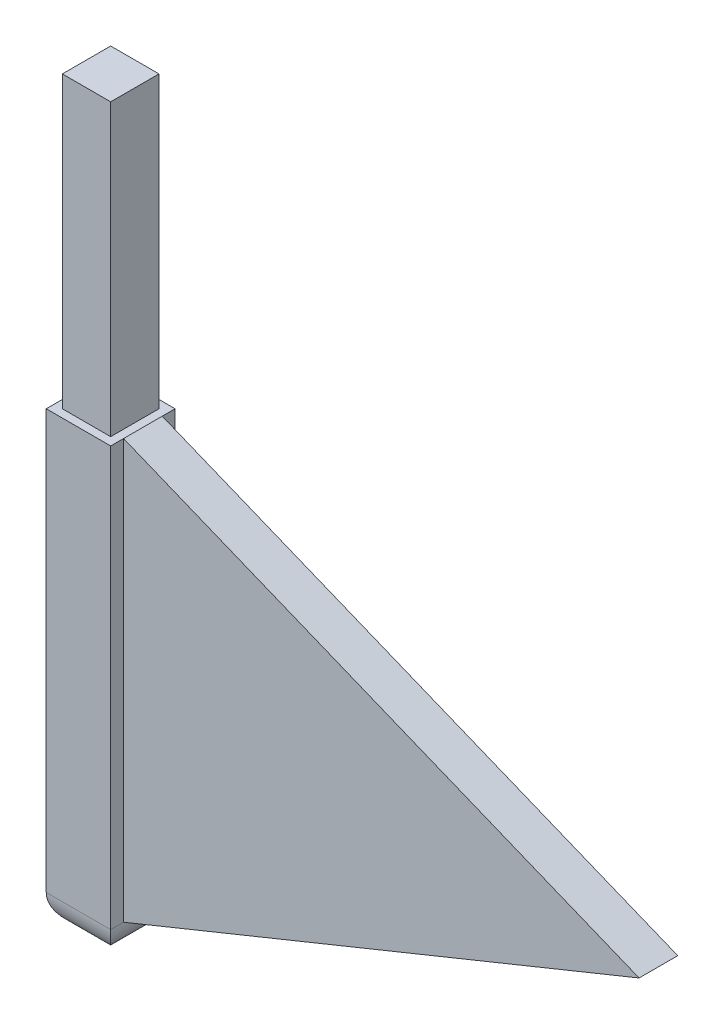
ISO-10303-21;
HEADER;
FILE_DESCRIPTION(('STEP AP214'),'2;1');
FILE_NAME('part.step','',(''),(''),'','','');
FILE_SCHEMA(('AUTOMOTIVE_DESIGN { 1 0 10303 214 1 1 1 1 }'));
ENDSEC;
DATA;
#1=APPLICATION_CONTEXT('core data for automotive mechanical design processes');
#2=APPLICATION_PROTOCOL_DEFINITION('international standard','automotive_design',2000,#1);
#3=PRODUCT_CONTEXT('',#1,'mechanical');
#4=PRODUCT('Part','Part','',(#3));
#5=PRODUCT_RELATED_PRODUCT_CATEGORY('part','',(#4));
#6=PRODUCT_DEFINITION_FORMATION('','',#4);
#7=PRODUCT_DEFINITION_CONTEXT('part definition',#1,'design');
#8=PRODUCT_DEFINITION('design','',#6,#7);
#9=PRODUCT_DEFINITION_SHAPE('','',#8);
#10=(LENGTH_UNIT() NAMED_UNIT(*) SI_UNIT(.MILLI.,.METRE.));
#11=(NAMED_UNIT(*) PLANE_ANGLE_UNIT() SI_UNIT($,.RADIAN.));
#12=(NAMED_UNIT(*) SI_UNIT($,.STERADIAN.) SOLID_ANGLE_UNIT());
#13=UNCERTAINTY_MEASURE_WITH_UNIT(LENGTH_MEASURE(1.E-05),#10,'distance_accuracy_value','');
#14=(GEOMETRIC_REPRESENTATION_CONTEXT(3) GLOBAL_UNCERTAINTY_ASSIGNED_CONTEXT((#13)) GLOBAL_UNIT_ASSIGNED_CONTEXT((#10,
#11,#12)) REPRESENTATION_CONTEXT('',''));
#15=CARTESIAN_POINT('',(0.,0.,0.));
#16=DIRECTION('',(0.,0.,1.));
#17=DIRECTION('',(1.,0.,0.));
#18=AXIS2_PLACEMENT_3D('',#15,#16,#17);
#19=CARTESIAN_POINT('',(2.54,29.21,0.));
#20=DIRECTION('',(-1.,0.,0.));
#21=DIRECTION('',(0.,0.,1.));
#22=AXIS2_PLACEMENT_3D('',#19,#20,#21);
#23=PLANE('',#22);
#24=DIRECTION('',(0.,-1.,0.));
#25=VECTOR('',#24,1.);
#26=CARTESIAN_POINT('',(2.54,17.78,-0.508));
#27=LINE('',#26,#25);
#28=CARTESIAN_POINT('',(2.54,17.78,-0.508000000000002));
#29=VERTEX_POINT('',#28);
#30=CARTESIAN_POINT('',(2.54,1.27000000000001,-0.508000000000002));
#31=VERTEX_POINT('',#30);
#32=EDGE_CURVE('E141',#29,#31,#27,.T.);
#33=ORIENTED_EDGE('',*,*,#32,.F.);
#34=DIRECTION('',(0.,0.,-1.));
#35=VECTOR('',#34,1.);
#36=CARTESIAN_POINT('',(2.54,17.78,0.));
#37=LINE('',#36,#35);
#38=CARTESIAN_POINT('',(2.54,17.78,0.));
#39=VERTEX_POINT('',#38);
#40=EDGE_CURVE('E198',#39,#29,#37,.T.);
#41=ORIENTED_EDGE('',*,*,#40,.F.);
#42=DIRECTION('',(0.,-1.,0.));
#43=VECTOR('',#42,1.);
#44=CARTESIAN_POINT('',(2.54,29.21,0.));
#45=LINE('',#44,#43);
#46=CARTESIAN_POINT('',(2.54,1.27000000000001,0.));
#47=VERTEX_POINT('',#46);
#48=EDGE_CURVE('E207',#39,#47,#45,.T.);
#49=ORIENTED_EDGE('',*,*,#48,.T.);
#50=DIRECTION('',(0.,0.,-1.));
#51=VECTOR('',#50,1.);
#52=CARTESIAN_POINT('',(2.54,1.27,-2.54));
#53=LINE('',#52,#51);
#54=EDGE_CURVE('E222',#47,#31,#53,.T.);
#55=ORIENTED_EDGE('',*,*,#54,.T.);
#56=EDGE_LOOP('',(#33,#41,#49,#55));
#57=FACE_BOUND('',#56,.T.);
#58=ADVANCED_FACE('F48',(#57),#23,.F.);
#59=DIRECTION('',(0.,1.,0.));
#60=VECTOR('',#59,1.);
#61=CARTESIAN_POINT('',(2.54,17.78,-2.032));
#62=LINE('',#61,#60);
#63=CARTESIAN_POINT('',(2.54,1.27000000000001,-2.032));
#64=VERTEX_POINT('',#63);
#65=CARTESIAN_POINT('',(2.54,17.78,-2.032));
#66=VERTEX_POINT('',#65);
#67=EDGE_CURVE('E160',#64,#66,#62,.T.);
#68=ORIENTED_EDGE('',*,*,#67,.F.);
#69=CARTESIAN_POINT('',(2.54,1.27000000000001,-2.54));
#70=VERTEX_POINT('',#69);
#71=EDGE_CURVE('E219',#64,#70,#53,.T.);
#72=ORIENTED_EDGE('',*,*,#71,.T.);
#73=DIRECTION('',(0.,-1.,0.));
#74=VECTOR('',#73,1.);
#75=CARTESIAN_POINT('',(2.54,29.21,-2.54));
#76=LINE('',#75,#74);
#77=CARTESIAN_POINT('',(2.54,17.78,-2.54));
#78=VERTEX_POINT('',#77);
#79=EDGE_CURVE('E206',#78,#70,#76,.T.);
#80=ORIENTED_EDGE('',*,*,#79,.F.);
#81=EDGE_CURVE('E189',#66,#78,#37,.T.);
#82=ORIENTED_EDGE('',*,*,#81,.F.);
#83=EDGE_LOOP('',(#68,#72,#80,#82));
#84=FACE_BOUND('',#83,.T.);
#85=ADVANCED_FACE('F257',(#84),#23,.F.);
#86=CARTESIAN_POINT('',(0.,29.21,0.));
#87=DIRECTION('',(1.,0.,0.));
#88=DIRECTION('',(0.,0.,-1.));
#89=AXIS2_PLACEMENT_3D('',#86,#87,#88);
#90=PLANE('',#89);
#91=DIRECTION('',(0.,-1.,0.));
#92=VECTOR('',#91,1.);
#93=CARTESIAN_POINT('',(0.,29.21,-2.54));
#94=LINE('',#93,#92);
#95=CARTESIAN_POINT('',(0.,17.78,-2.54));
#96=VERTEX_POINT('',#95);
#97=CARTESIAN_POINT('',(0.,1.27000000000001,-2.54));
#98=VERTEX_POINT('',#97);
#99=EDGE_CURVE('E201',#96,#98,#94,.T.);
#100=ORIENTED_EDGE('',*,*,#99,.T.);
#101=DIRECTION('',(0.,0.,1.));
#102=VECTOR('',#101,1.);
#103=CARTESIAN_POINT('',(0.,1.27,0.));
#104=LINE('',#103,#102);
#105=CARTESIAN_POINT('',(0.,1.27000000000001,0.));
#106=VERTEX_POINT('',#105);
#107=EDGE_CURVE('E214',#98,#106,#104,.T.);
#108=ORIENTED_EDGE('',*,*,#107,.T.);
#109=DIRECTION('',(0.,-1.,0.));
#110=VECTOR('',#109,1.);
#111=CARTESIAN_POINT('',(0.,29.21,0.));
#112=LINE('',#111,#110);
#113=CARTESIAN_POINT('',(0.,17.78,0.));
#114=VERTEX_POINT('',#113);
#115=EDGE_CURVE('E211',#114,#106,#112,.T.);
#116=ORIENTED_EDGE('',*,*,#115,.F.);
#117=DIRECTION('',(0.,0.,1.));
#118=VECTOR('',#117,1.);
#119=CARTESIAN_POINT('',(0.,17.78,0.));
#120=LINE('',#119,#118);
#121=EDGE_CURVE('E203',#96,#114,#120,.T.);
#122=ORIENTED_EDGE('',*,*,#121,.F.);
#123=EDGE_LOOP('',(#100,#108,#116,#122));
#124=FACE_BOUND('',#123,.T.);
#125=ADVANCED_FACE('F248',(#124),#90,.F.);
#126=CARTESIAN_POINT('',(0.,29.21,0.));
#127=DIRECTION('',(0.,0.,-1.));
#128=DIRECTION('',(-1.,0.,0.));
#129=AXIS2_PLACEMENT_3D('',#126,#127,#128);
#130=PLANE('',#129);
#131=ORIENTED_EDGE('',*,*,#115,.T.);
#132=DIRECTION('',(1.,0.,0.));
#133=VECTOR('',#132,1.);
#134=CARTESIAN_POINT('',(2.54,1.27,0.));
#135=LINE('',#134,#133);
#136=EDGE_CURVE('E60',#106,#47,#135,.T.);
#137=ORIENTED_EDGE('',*,*,#136,.T.);
#138=ORIENTED_EDGE('',*,*,#48,.F.);
#139=DIRECTION('',(1.,0.,0.));
#140=VECTOR('',#139,1.);
#141=CARTESIAN_POINT('',(0.,17.78,0.));
#142=LINE('',#141,#140);
#143=EDGE_CURVE('E200',#114,#39,#142,.T.);
#144=ORIENTED_EDGE('',*,*,#143,.F.);
#145=EDGE_LOOP('',(#131,#137,#138,#144));
#146=FACE_BOUND('',#145,.T.);
#147=ADVANCED_FACE('F251',(#146),#130,.F.);
#148=CARTESIAN_POINT('',(0.,29.21,-2.54));
#149=DIRECTION('',(0.,0.,1.));
#150=DIRECTION('',(1.,0.,0.));
#151=AXIS2_PLACEMENT_3D('',#148,#149,#150);
#152=PLANE('',#151);
#153=ORIENTED_EDGE('',*,*,#79,.T.);
#154=DIRECTION('',(-1.,0.,0.));
#155=VECTOR('',#154,1.);
#156=CARTESIAN_POINT('',(0.,1.27,-2.54));
#157=LINE('',#156,#155);
#158=EDGE_CURVE('E217',#70,#98,#157,.T.);
#159=ORIENTED_EDGE('',*,*,#158,.T.);
#160=ORIENTED_EDGE('',*,*,#99,.F.);
#161=DIRECTION('',(-1.,0.,0.));
#162=VECTOR('',#161,1.);
#163=CARTESIAN_POINT('',(0.,17.78,-2.54));
#164=LINE('',#163,#162);
#165=EDGE_CURVE('E213',#78,#96,#164,.T.);
#166=ORIENTED_EDGE('',*,*,#165,.F.);
#167=EDGE_LOOP('',(#153,#159,#160,#166));
#168=FACE_BOUND('',#167,.T.);
#169=ADVANCED_FACE('F267',(#168),#152,.F.);
#170=CARTESIAN_POINT('',(1.27,17.78,-1.27));
#171=DIRECTION('',(0.,1.,0.));
#172=DIRECTION('',(0.,0.,1.));
#173=AXIS2_PLACEMENT_3D('',#170,#171,#172);
#174=PLANE('',#173);
#175=DIRECTION('',(0.,0.,1.));
#176=VECTOR('',#175,1.);
#177=CARTESIAN_POINT('',(2.54,17.78,-2.54));
#178=LINE('',#177,#176);
#179=EDGE_CURVE('E150',#66,#29,#178,.T.);
#180=ORIENTED_EDGE('',*,*,#179,.F.);
#181=ORIENTED_EDGE('',*,*,#81,.T.);
#182=ORIENTED_EDGE('',*,*,#165,.T.);
#183=ORIENTED_EDGE('',*,*,#121,.T.);
#184=ORIENTED_EDGE('',*,*,#143,.T.);
#185=ORIENTED_EDGE('',*,*,#40,.T.);
#186=EDGE_LOOP('',(#180,#181,#182,#183,#184,#185));
#187=FACE_BOUND('',#186,.T.);
#188=DIRECTION('',(-1.,0.,0.));
#189=VECTOR('',#188,1.);
#190=CARTESIAN_POINT('',(0.3175,17.78,-2.2225));
#191=LINE('',#190,#189);
#192=CARTESIAN_POINT('',(2.2225,17.78,-2.2225));
#193=VERTEX_POINT('',#192);
#194=CARTESIAN_POINT('',(0.3175,17.78,-2.2225));
#195=VERTEX_POINT('',#194);
#196=EDGE_CURVE('E173',#193,#195,#191,.T.);
#197=ORIENTED_EDGE('',*,*,#196,.F.);
#198=DIRECTION('',(0.,0.,-1.));
#199=VECTOR('',#198,1.);
#200=CARTESIAN_POINT('',(2.2225,17.78,-0.317500000000005));
#201=LINE('',#200,#199);
#202=CARTESIAN_POINT('',(2.2225,17.78,-0.317500000000005));
#203=VERTEX_POINT('',#202);
#204=EDGE_CURVE('E169',#203,#193,#201,.T.);
#205=ORIENTED_EDGE('',*,*,#204,.F.);
#206=DIRECTION('',(1.,0.,0.));
#207=VECTOR('',#206,1.);
#208=CARTESIAN_POINT('',(0.3175,17.78,-0.317500000000005));
#209=LINE('',#208,#207);
#210=CARTESIAN_POINT('',(0.3175,17.78,-0.317500000000005));
#211=VERTEX_POINT('',#210);
#212=EDGE_CURVE('E163',#211,#203,#209,.T.);
#213=ORIENTED_EDGE('',*,*,#212,.F.);
#214=DIRECTION('',(0.,0.,1.));
#215=VECTOR('',#214,1.);
#216=CARTESIAN_POINT('',(0.3175,17.78,-0.317500000000005));
#217=LINE('',#216,#215);
#218=EDGE_CURVE('E161',#195,#211,#217,.T.);
#219=ORIENTED_EDGE('',*,*,#218,.F.);
#220=EDGE_LOOP('',(#197,#205,#213,#219));
#221=FACE_BOUND('',#220,.T.);
#222=ADVANCED_FACE('F258',(#187,#221),#174,.T.);
#223=CARTESIAN_POINT('',(0.3175,17.78,-0.317500000000005));
#224=DIRECTION('',(-1.,0.,0.));
#225=DIRECTION('',(0.,0.,1.));
#226=AXIS2_PLACEMENT_3D('',#223,#224,#225);
#227=PLANE('',#226);
#228=DIRECTION('',(0.,0.,1.));
#229=VECTOR('',#228,1.);
#230=CARTESIAN_POINT('',(0.3175,29.21,-0.317500000000005));
#231=LINE('',#230,#229);
#232=CARTESIAN_POINT('',(0.3175,29.21,-2.2225));
#233=VERTEX_POINT('',#232);
#234=CARTESIAN_POINT('',(0.3175,29.21,-0.317500000000005));
#235=VERTEX_POINT('',#234);
#236=EDGE_CURVE('E172',#233,#235,#231,.T.);
#237=ORIENTED_EDGE('',*,*,#236,.F.);
#238=DIRECTION('',(0.,1.,0.));
#239=VECTOR('',#238,1.);
#240=CARTESIAN_POINT('',(0.3175,17.78,-2.2225));
#241=LINE('',#240,#239);
#242=EDGE_CURVE('E190',#195,#233,#241,.T.);
#243=ORIENTED_EDGE('',*,*,#242,.F.);
#244=ORIENTED_EDGE('',*,*,#218,.T.);
#245=DIRECTION('',(0.,1.,0.));
#246=VECTOR('',#245,1.);
#247=CARTESIAN_POINT('',(0.3175,17.78,-0.317500000000005));
#248=LINE('',#247,#246);
#249=EDGE_CURVE('E174',#211,#235,#248,.T.);
#250=ORIENTED_EDGE('',*,*,#249,.T.);
#251=EDGE_LOOP('',(#237,#243,#244,#250));
#252=FACE_BOUND('',#251,.T.);
#253=ADVANCED_FACE('F296',(#252),#227,.T.);
#254=CARTESIAN_POINT('',(0.3175,17.78,-2.2225));
#255=DIRECTION('',(0.,0.,-1.));
#256=DIRECTION('',(-1.,0.,0.));
#257=AXIS2_PLACEMENT_3D('',#254,#255,#256);
#258=PLANE('',#257);
#259=DIRECTION('',(-1.,0.,0.));
#260=VECTOR('',#259,1.);
#261=CARTESIAN_POINT('',(0.3175,29.21,-2.2225));
#262=LINE('',#261,#260);
#263=CARTESIAN_POINT('',(2.2225,29.21,-2.2225));
#264=VERTEX_POINT('',#263);
#265=EDGE_CURVE('E164',#264,#233,#262,.T.);
#266=ORIENTED_EDGE('',*,*,#265,.F.);
#267=DIRECTION('',(0.,1.,0.));
#268=VECTOR('',#267,1.);
#269=CARTESIAN_POINT('',(2.2225,17.78,-2.2225));
#270=LINE('',#269,#268);
#271=EDGE_CURVE('E187',#193,#264,#270,.T.);
#272=ORIENTED_EDGE('',*,*,#271,.F.);
#273=ORIENTED_EDGE('',*,*,#196,.T.);
#274=ORIENTED_EDGE('',*,*,#242,.T.);
#275=EDGE_LOOP('',(#266,#272,#273,#274));
#276=FACE_BOUND('',#275,.T.);
#277=ADVANCED_FACE('F297',(#276),#258,.T.);
#278=CARTESIAN_POINT('',(2.2225,17.78,-0.317500000000005));
#279=DIRECTION('',(1.,0.,0.));
#280=DIRECTION('',(0.,0.,-1.));
#281=AXIS2_PLACEMENT_3D('',#278,#279,#280);
#282=PLANE('',#281);
#283=DIRECTION('',(0.,0.,-1.));
#284=VECTOR('',#283,1.);
#285=CARTESIAN_POINT('',(2.2225,29.21,-0.317500000000005));
#286=LINE('',#285,#284);
#287=CARTESIAN_POINT('',(2.2225,29.21,-0.317500000000005));
#288=VERTEX_POINT('',#287);
#289=EDGE_CURVE('E185',#288,#264,#286,.T.);
#290=ORIENTED_EDGE('',*,*,#289,.F.);
#291=DIRECTION('',(0.,1.,0.));
#292=VECTOR('',#291,1.);
#293=CARTESIAN_POINT('',(2.2225,17.78,-0.317500000000005));
#294=LINE('',#293,#292);
#295=EDGE_CURVE('E191',#203,#288,#294,.T.);
#296=ORIENTED_EDGE('',*,*,#295,.F.);
#297=ORIENTED_EDGE('',*,*,#204,.T.);
#298=ORIENTED_EDGE('',*,*,#271,.T.);
#299=EDGE_LOOP('',(#290,#296,#297,#298));
#300=FACE_BOUND('',#299,.T.);
#301=ADVANCED_FACE('F291',(#300),#282,.T.);
#302=CARTESIAN_POINT('',(0.3175,17.78,-0.317500000000005));
#303=DIRECTION('',(0.,0.,1.));
#304=DIRECTION('',(1.,0.,0.));
#305=AXIS2_PLACEMENT_3D('',#302,#303,#304);
#306=PLANE('',#305);
#307=DIRECTION('',(1.,0.,0.));
#308=VECTOR('',#307,1.);
#309=CARTESIAN_POINT('',(0.3175,29.21,-0.317500000000005));
#310=LINE('',#309,#308);
#311=EDGE_CURVE('E180',#235,#288,#310,.T.);
#312=ORIENTED_EDGE('',*,*,#311,.F.);
#313=ORIENTED_EDGE('',*,*,#249,.F.);
#314=ORIENTED_EDGE('',*,*,#212,.T.);
#315=ORIENTED_EDGE('',*,*,#295,.T.);
#316=EDGE_LOOP('',(#312,#313,#314,#315));
#317=FACE_BOUND('',#316,.T.);
#318=ADVANCED_FACE('F290',(#317),#306,.T.);
#319=CARTESIAN_POINT('',(0.,29.21,0.));
#320=DIRECTION('',(0.,-1.,0.));
#321=DIRECTION('',(0.,0.,-1.));
#322=AXIS2_PLACEMENT_3D('',#319,#320,#321);
#323=PLANE('',#322);
#324=ORIENTED_EDGE('',*,*,#236,.T.);
#325=ORIENTED_EDGE('',*,*,#311,.T.);
#326=ORIENTED_EDGE('',*,*,#289,.T.);
#327=ORIENTED_EDGE('',*,*,#265,.T.);
#328=EDGE_LOOP('',(#324,#325,#326,#327));
#329=FACE_BOUND('',#328,.T.);
#330=ADVANCED_FACE('F281',(#329),#323,.F.);
#331=CARTESIAN_POINT('',(1.27,1.27,0.));
#332=DIRECTION('',(0.,0.,1.));
#333=DIRECTION('',(1.,0.,0.));
#334=AXIS2_PLACEMENT_3D('',#331,#332,#333);
#335=CYLINDRICAL_SURFACE('',#334,1.27);
#336=CARTESIAN_POINT('',(1.27,1.27,-1.27));
#337=DIRECTION('',(0.707106781186547,0.,0.707106781186547));
#338=DIRECTION('',(-0.707106781186547,0.,0.707106781186547));
#339=AXIS2_PLACEMENT_3D('',#336,#337,#338);
#340=ELLIPSE('',#339,1.79605122421383,1.27);
#341=CARTESIAN_POINT('',(1.27,0.,-1.27));
#342=VERTEX_POINT('',#341);
#343=EDGE_CURVE('E178',#70,#342,#340,.F.);
#344=ORIENTED_EDGE('',*,*,#343,.F.);
#345=ORIENTED_EDGE('',*,*,#71,.F.);
#346=DIRECTION('',(0.,0.,-1.));
#347=VECTOR('',#346,1.);
#348=CARTESIAN_POINT('',(2.54,1.27000000000001,-0.508000000000002));
#349=LINE('',#348,#347);
#350=EDGE_CURVE('E154',#31,#64,#349,.T.);
#351=ORIENTED_EDGE('',*,*,#350,.F.);
#352=ORIENTED_EDGE('',*,*,#54,.F.);
#353=CARTESIAN_POINT('',(1.27,1.27,-1.27));
#354=DIRECTION('',(-0.707106781186547,0.,0.707106781186547));
#355=DIRECTION('',(-0.707106781186547,0.,-0.707106781186547));
#356=AXIS2_PLACEMENT_3D('',#353,#354,#355);
#357=ELLIPSE('',#356,1.79605122421383,1.27);
#358=EDGE_CURVE('E229',#342,#47,#357,.T.);
#359=ORIENTED_EDGE('',*,*,#358,.F.);
#360=EDGE_LOOP('',(#344,#345,#351,#352,#359));
#361=FACE_BOUND('',#360,.T.);
#362=ADVANCED_FACE('F49',(#361),#335,.T.);
#363=CARTESIAN_POINT('',(0.,1.27,-1.27));
#364=DIRECTION('',(1.,0.,0.));
#365=DIRECTION('',(0.,0.,-1.));
#366=AXIS2_PLACEMENT_3D('',#363,#364,#365);
#367=CYLINDRICAL_SURFACE('',#366,1.27);
#368=ORIENTED_EDGE('',*,*,#158,.F.);
#369=ORIENTED_EDGE('',*,*,#343,.T.);
#370=CARTESIAN_POINT('',(1.27,1.27,-1.27));
#371=DIRECTION('',(0.707106781186547,0.,-0.707106781186547));
#372=DIRECTION('',(0.707106781186547,0.,0.707106781186547));
#373=AXIS2_PLACEMENT_3D('',#370,#371,#372);
#374=ELLIPSE('',#373,1.79605122421383,1.27);
#375=EDGE_CURVE('E228',#98,#342,#374,.F.);
#376=ORIENTED_EDGE('',*,*,#375,.F.);
#377=EDGE_LOOP('',(#368,#369,#376));
#378=FACE_BOUND('',#377,.T.);
#379=ADVANCED_FACE('F240',(#378),#367,.T.);
#380=CARTESIAN_POINT('',(0.,1.27,-1.27));
#381=DIRECTION('',(-1.,0.,0.));
#382=DIRECTION('',(0.,0.,1.));
#383=AXIS2_PLACEMENT_3D('',#380,#381,#382);
#384=CYLINDRICAL_SURFACE('',#383,1.27);
#385=ORIENTED_EDGE('',*,*,#358,.T.);
#386=ORIENTED_EDGE('',*,*,#136,.F.);
#387=CARTESIAN_POINT('',(1.27,1.27,-1.27));
#388=DIRECTION('',(-0.707106781186547,0.,-0.707106781186547));
#389=DIRECTION('',(-0.707106781186547,0.,0.707106781186547));
#390=AXIS2_PLACEMENT_3D('',#387,#388,#389);
#391=ELLIPSE('',#390,1.79605122421383,1.27);
#392=EDGE_CURVE('E159',#342,#106,#391,.T.);
#393=ORIENTED_EDGE('',*,*,#392,.F.);
#394=EDGE_LOOP('',(#385,#386,#393));
#395=FACE_BOUND('',#394,.T.);
#396=ADVANCED_FACE('F249',(#395),#384,.T.);
#397=CARTESIAN_POINT('',(1.27,1.27,0.));
#398=DIRECTION('',(0.,0.,-1.));
#399=DIRECTION('',(-1.,0.,0.));
#400=AXIS2_PLACEMENT_3D('',#397,#398,#399);
#401=CYLINDRICAL_SURFACE('',#400,1.27);
#402=ORIENTED_EDGE('',*,*,#107,.F.);
#403=ORIENTED_EDGE('',*,*,#375,.T.);
#404=ORIENTED_EDGE('',*,*,#392,.T.);
#405=EDGE_LOOP('',(#402,#403,#404));
#406=FACE_BOUND('',#405,.T.);
#407=ADVANCED_FACE('F242',(#406),#401,.T.);
#408=CARTESIAN_POINT('',(22.86,17.78,-0.508));
#409=DIRECTION('',(0.,0.,-1.));
#410=DIRECTION('',(0.,1.,0.));
#411=AXIS2_PLACEMENT_3D('',#408,#409,#410);
#412=PLANE('',#411);
#413=ORIENTED_EDGE('',*,*,#32,.T.);
#414=DIRECTION('',(-0.926466577122309,-0.376377046955938,0.));
#415=VECTOR('',#414,1.);
#416=CARTESIAN_POINT('',(2.54,1.27000000000001,-0.508000000000002));
#417=LINE('',#416,#415);
#418=CARTESIAN_POINT('',(22.86,9.525,-0.508000000000002));
#419=VERTEX_POINT('',#418);
#420=EDGE_CURVE('E128',#419,#31,#417,.T.);
#421=ORIENTED_EDGE('',*,*,#420,.F.);
#422=DIRECTION('',(0.926466577122309,-0.376377046955938,0.));
#423=VECTOR('',#422,1.);
#424=CARTESIAN_POINT('',(2.54,17.78,-0.508000000000002));
#425=LINE('',#424,#423);
#426=EDGE_CURVE('E143',#29,#419,#425,.T.);
#427=ORIENTED_EDGE('',*,*,#426,.F.);
#428=EDGE_LOOP('',(#413,#421,#427));
#429=FACE_BOUND('',#428,.T.);
#430=ADVANCED_FACE('F137',(#429),#412,.F.);
#431=CARTESIAN_POINT('',(22.86,17.78,-2.032));
#432=DIRECTION('',(0.,0.,1.));
#433=DIRECTION('',(0.,-1.,0.));
#434=AXIS2_PLACEMENT_3D('',#431,#432,#433);
#435=PLANE('',#434);
#436=DIRECTION('',(0.926466577122309,-0.376377046955938,0.));
#437=VECTOR('',#436,1.);
#438=CARTESIAN_POINT('',(19.9814752724225,10.6944006705784,-2.032));
#439=LINE('',#438,#437);
#440=CARTESIAN_POINT('',(22.86,9.525,-2.032));
#441=VERTEX_POINT('',#440);
#442=EDGE_CURVE('E149',#66,#441,#439,.T.);
#443=ORIENTED_EDGE('',*,*,#442,.T.);
#444=DIRECTION('',(-0.926466577122309,-0.376377046955938,0.));
#445=VECTOR('',#444,1.);
#446=CARTESIAN_POINT('',(25.7385247275775,10.6944006705784,-2.032));
#447=LINE('',#446,#445);
#448=EDGE_CURVE('E131',#441,#64,#447,.T.);
#449=ORIENTED_EDGE('',*,*,#448,.T.);
#450=ORIENTED_EDGE('',*,*,#67,.T.);
#451=EDGE_LOOP('',(#443,#449,#450));
#452=FACE_BOUND('',#451,.T.);
#453=ADVANCED_FACE('F309',(#452),#435,.F.);
#454=CARTESIAN_POINT('',(2.54,17.78,-2.54));
#455=DIRECTION('',(-0.376377046955938,-0.926466577122309,0.));
#456=DIRECTION('',(0.926466577122309,-0.376377046955938,0.));
#457=AXIS2_PLACEMENT_3D('',#454,#455,#456);
#458=PLANE('',#457);
#459=ORIENTED_EDGE('',*,*,#179,.T.);
#460=ORIENTED_EDGE('',*,*,#426,.T.);
#461=DIRECTION('',(0.,0.,-1.));
#462=VECTOR('',#461,1.);
#463=CARTESIAN_POINT('',(22.86,9.525,0.));
#464=LINE('',#463,#462);
#465=EDGE_CURVE('E13',#419,#441,#464,.T.);
#466=ORIENTED_EDGE('',*,*,#465,.T.);
#467=ORIENTED_EDGE('',*,*,#442,.F.);
#468=EDGE_LOOP('',(#459,#460,#466,#467));
#469=FACE_BOUND('',#468,.T.);
#470=ADVANCED_FACE('F144',(#469),#458,.F.);
#471=CARTESIAN_POINT('',(2.54,1.27000000000001,-2.54));
#472=DIRECTION('',(-0.376377046955938,0.926466577122309,0.));
#473=DIRECTION('',(-0.926466577122309,-0.376377046955938,0.));
#474=AXIS2_PLACEMENT_3D('',#471,#472,#473);
#475=PLANE('',#474);
#476=ORIENTED_EDGE('',*,*,#465,.F.);
#477=ORIENTED_EDGE('',*,*,#420,.T.);
#478=ORIENTED_EDGE('',*,*,#350,.T.);
#479=ORIENTED_EDGE('',*,*,#448,.F.);
#480=EDGE_LOOP('',(#476,#477,#478,#479));
#481=FACE_BOUND('',#480,.T.);
#482=ADVANCED_FACE('F129',(#481),#475,.F.);
#483=CLOSED_SHELL('',(#58,#85,#125,#147,#169,#222,#253,#277,#301,#318,#330,#362,#379,#396,#407,
#430,#453,#470,#482));
#484=MANIFOLD_SOLID_BREP('B2',#483);
#485=ADVANCED_BREP_SHAPE_REPRESENTATION('',(#18,#484),#14);
#486=SHAPE_DEFINITION_REPRESENTATION(#9,#485);
ENDSEC;
END-ISO-10303-21;
